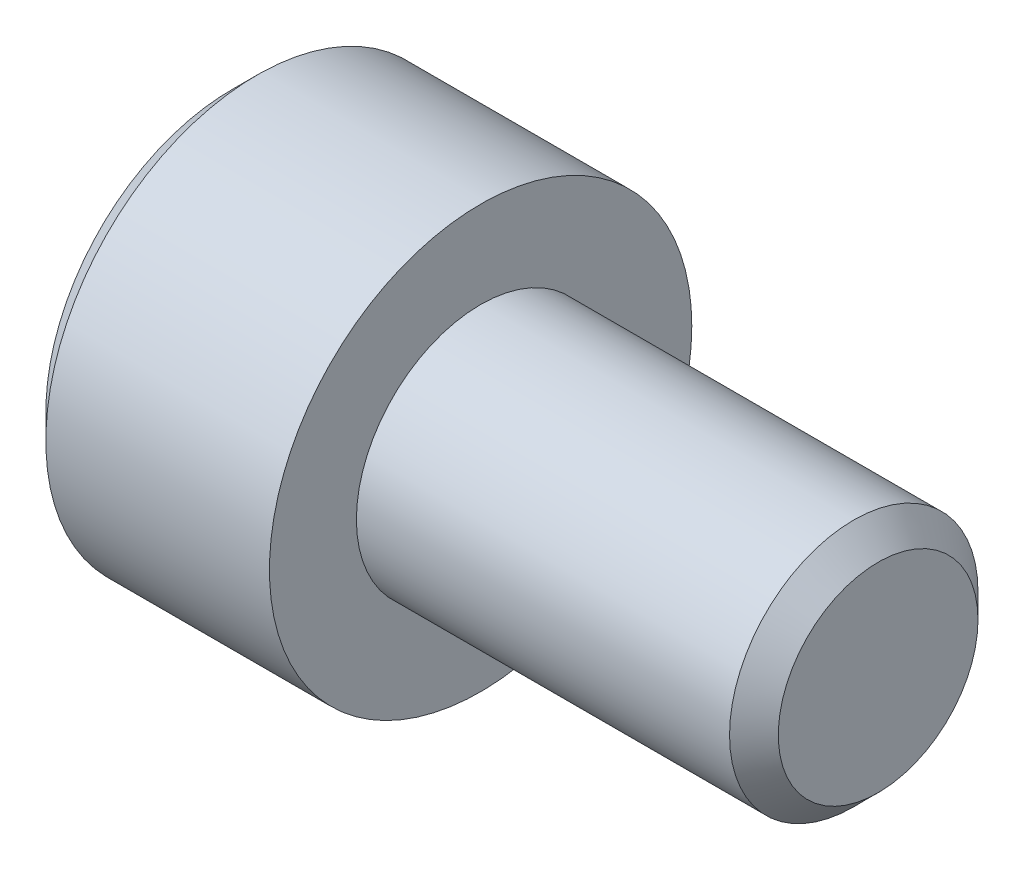
ISO-10303-21;
HEADER;
FILE_DESCRIPTION(('STEP AP214'),'2;1');
FILE_NAME('part.step','',(''),(''),'','','');
FILE_SCHEMA(('AUTOMOTIVE_DESIGN { 1 0 10303 214 1 1 1 1 }'));
ENDSEC;
DATA;
#1=APPLICATION_CONTEXT('core data for automotive mechanical design processes');
#2=APPLICATION_PROTOCOL_DEFINITION('international standard','automotive_design',2000,#1);
#3=PRODUCT_CONTEXT('',#1,'mechanical');
#4=PRODUCT('Part','Part','',(#3));
#5=PRODUCT_RELATED_PRODUCT_CATEGORY('part','',(#4));
#6=PRODUCT_DEFINITION_FORMATION('','',#4);
#7=PRODUCT_DEFINITION_CONTEXT('part definition',#1,'design');
#8=PRODUCT_DEFINITION('design','',#6,#7);
#9=PRODUCT_DEFINITION_SHAPE('','',#8);
#10=(LENGTH_UNIT() NAMED_UNIT(*) SI_UNIT(.MILLI.,.METRE.));
#11=(NAMED_UNIT(*) PLANE_ANGLE_UNIT() SI_UNIT($,.RADIAN.));
#12=(NAMED_UNIT(*) SI_UNIT($,.STERADIAN.) SOLID_ANGLE_UNIT());
#13=UNCERTAINTY_MEASURE_WITH_UNIT(LENGTH_MEASURE(1.E-05),#10,'distance_accuracy_value','');
#14=(GEOMETRIC_REPRESENTATION_CONTEXT(3) GLOBAL_UNCERTAINTY_ASSIGNED_CONTEXT((#13)) GLOBAL_UNIT_ASSIGNED_CONTEXT((#10,
#11,#12)) REPRESENTATION_CONTEXT('',''));
#15=CARTESIAN_POINT('',(0.,0.,0.));
#16=DIRECTION('',(0.,0.,1.));
#17=DIRECTION('',(1.,0.,0.));
#18=AXIS2_PLACEMENT_3D('',#15,#16,#17);
#19=CARTESIAN_POINT('',(-5.,8.88178419700125E-13,-3.05311331771918E-13));
#20=DIRECTION('',(0.999999999999997,0.,0.));
#21=DIRECTION('',(0.,0.,-1.00000000000004));
#22=AXIS2_PLACEMENT_3D('',#19,#20,#21);
#23=PLANE('',#22);
#24=CARTESIAN_POINT('',(-5.,8.88178419700125E-13,-3.05311331771918E-13));
#25=DIRECTION('',(0.999999999999997,0.,0.));
#26=DIRECTION('',(0.,0.,-1.00000000000004));
#27=AXIS2_PLACEMENT_3D('',#24,#25,#26);
#28=CIRCLE('',#27,3.75);
#29=CARTESIAN_POINT('',(-5.,8.95464258299228E-13,-3.75000000000044));
#30=VERTEX_POINT('',#29);
#31=EDGE_CURVE('E11',#30,#30,#28,.T.);
#32=ORIENTED_EDGE('',*,*,#31,.F.);
#33=EDGE_LOOP('',(#32));
#34=FACE_BOUND('',#33,.T.);
#35=DIRECTION('',(0.,0.499999999999994,-0.866025403784471));
#36=VECTOR('',#35,1.);
#37=CARTESIAN_POINT('',(-5.,-2.30940107675748,-2.4980018054066E-13));
#38=LINE('',#37,#36);
#39=CARTESIAN_POINT('',(-5.,-2.30940107675748,-2.4980018054066E-13));
#40=VERTEX_POINT('',#39);
#41=CARTESIAN_POINT('',(-5.,-1.15470053837802,-2.00000000000039));
#42=VERTEX_POINT('',#41);
#43=EDGE_CURVE('E152',#40,#42,#38,.T.);
#44=ORIENTED_EDGE('',*,*,#43,.T.);
#45=DIRECTION('',(0.,0.999999999999987,0.));
#46=VECTOR('',#45,1.);
#47=CARTESIAN_POINT('',(-5.,-1.15470053837802,-2.00000000000039));
#48=LINE('',#47,#46);
#49=CARTESIAN_POINT('',(-5.,1.15470053838018,-2.0000000000002));
#50=VERTEX_POINT('',#49);
#51=EDGE_CURVE('E154',#42,#50,#48,.T.);
#52=ORIENTED_EDGE('',*,*,#51,.T.);
#53=DIRECTION('',(0.,0.499999999999991,0.866025403784469));
#54=VECTOR('',#53,1.);
#55=CARTESIAN_POINT('',(-5.,1.15470053838018,-2.0000000000002));
#56=LINE('',#55,#54);
#57=CARTESIAN_POINT('',(-5.,2.30940107675964,-5.27355936696949E-13));
#58=VERTEX_POINT('',#57);
#59=EDGE_CURVE('E157',#50,#58,#56,.T.);
#60=ORIENTED_EDGE('',*,*,#59,.T.);
#61=DIRECTION('',(0.,-0.499999999999994,0.866025403784471));
#62=VECTOR('',#61,1.);
#63=CARTESIAN_POINT('',(-5.,2.30940107675964,-5.27355936696949E-13));
#64=LINE('',#63,#62);
#65=CARTESIAN_POINT('',(-5.,1.15470053838007,1.99999999999964));
#66=VERTEX_POINT('',#65);
#67=EDGE_CURVE('E99',#58,#66,#64,.T.);
#68=ORIENTED_EDGE('',*,*,#67,.T.);
#69=DIRECTION('',(0.,-0.999999999999987,0.));
#70=VECTOR('',#69,1.);
#71=CARTESIAN_POINT('',(-5.,1.15470053838007,1.99999999999964));
#72=LINE('',#71,#70);
#73=CARTESIAN_POINT('',(-5.,-1.15470053837818,1.99999999999956));
#74=VERTEX_POINT('',#73);
#75=EDGE_CURVE('E159',#66,#74,#72,.T.);
#76=ORIENTED_EDGE('',*,*,#75,.T.);
#77=DIRECTION('',(0.,-0.499999999999991,-0.866025403784469));
#78=VECTOR('',#77,1.);
#79=CARTESIAN_POINT('',(-5.,-1.15470053837818,1.99999999999956));
#80=LINE('',#79,#78);
#81=EDGE_CURVE('E114',#74,#40,#80,.T.);
#82=ORIENTED_EDGE('',*,*,#81,.T.);
#83=EDGE_LOOP('',(#44,#52,#60,#68,#76,#82));
#84=FACE_BOUND('',#83,.T.);
#85=ADVANCED_FACE('F16',(#34,#84),#23,.F.);
#86=CARTESIAN_POINT('',(-5.,8.88178419700125E-13,-3.05311331771918E-13));
#87=DIRECTION('',(0.999999999999997,0.,0.));
#88=DIRECTION('',(0.,0.,-1.00000000000004));
#89=AXIS2_PLACEMENT_3D('',#86,#87,#88);
#90=CONICAL_SURFACE('',#89,3.75,0.785398163397448);
#91=CARTESIAN_POINT('',(-4.49999999999995,1.11022302462516E-12,-6.66133814775094E-13));
#92=DIRECTION('',(0.999999999999997,0.,0.));
#93=DIRECTION('',(0.,0.,-1.00000000000004));
#94=AXIS2_PLACEMENT_3D('',#91,#92,#93);
#95=CIRCLE('',#94,4.25);
#96=CARTESIAN_POINT('',(-4.49999999999995,8.96435705544937E-13,-4.25000000000052));
#97=VERTEX_POINT('',#96);
#98=EDGE_CURVE('E23',#97,#97,#95,.T.);
#99=CARTESIAN_POINT('',(-4.49999999999995,8.96435705544937E-13,-4.25000000000052));
#100=CARTESIAN_POINT('',(-4.50520833333328,8.96425586302794E-13,-4.24479166666718));
#101=CARTESIAN_POINT('',(-4.51041666666662,8.96415467060652E-13,-4.23958333333385));
#102=CARTESIAN_POINT('',(-4.52083333333328,8.96395228576366E-13,-4.22916666666718));
#103=CARTESIAN_POINT('',(-4.52604166666662,8.96385109334223E-13,-4.22395833333385));
#104=CARTESIAN_POINT('',(-4.53645833333329,8.96364870849937E-13,-4.21354166666718));
#105=CARTESIAN_POINT('',(-4.54166666666662,8.96354751607795E-13,-4.20833333333384));
#106=CARTESIAN_POINT('',(-4.55208333333329,8.96334513123509E-13,-4.19791666666718));
#107=CARTESIAN_POINT('',(-4.55729166666662,8.96324393881366E-13,-4.19270833333384));
#108=CARTESIAN_POINT('',(-4.56770833333329,8.96304155397081E-13,-4.18229166666717));
#109=CARTESIAN_POINT('',(-4.57291666666662,8.96294036154938E-13,-4.17708333333384));
#110=CARTESIAN_POINT('',(-4.58333333333329,8.96273797670652E-13,-4.16666666666717));
#111=CARTESIAN_POINT('',(-4.58854166666663,8.9626367842851E-13,-4.16145833333384));
#112=CARTESIAN_POINT('',(-4.59895833333329,8.96243439944224E-13,-4.15104166666717));
#113=CARTESIAN_POINT('',(-4.60416666666663,8.96233320702081E-13,-4.14583333333383));
#114=CARTESIAN_POINT('',(-4.61458333333329,8.96213082217795E-13,-4.13541666666717));
#115=CARTESIAN_POINT('',(-4.61979166666663,8.96202962975652E-13,-4.13020833333383));
#116=CARTESIAN_POINT('',(-4.6302083333333,8.96182724491367E-13,-4.11979166666717));
#117=CARTESIAN_POINT('',(-4.63541666666663,8.96172605249224E-13,-4.11458333333383));
#118=CARTESIAN_POINT('',(-4.6458333333333,8.96152366764939E-13,-4.10416666666716));
#119=CARTESIAN_POINT('',(-4.65104166666663,8.96142247522796E-13,-4.09895833333383));
#120=CARTESIAN_POINT('',(-4.6614583333333,8.9612200903851E-13,-4.08854166666716));
#121=CARTESIAN_POINT('',(-4.66666666666663,8.96111889796367E-13,-4.08333333333383));
#122=CARTESIAN_POINT('',(-4.6770833333333,8.96091651312082E-13,-4.07291666666716));
#123=CARTESIAN_POINT('',(-4.68229166666664,8.96081532069939E-13,-4.06770833333382));
#124=CARTESIAN_POINT('',(-4.6927083333333,8.96061293585653E-13,-4.05729166666715));
#125=CARTESIAN_POINT('',(-4.69791666666664,8.96051174343511E-13,-4.05208333333382));
#126=CARTESIAN_POINT('',(-4.7083333333333,8.96030935859225E-13,-4.04166666666715));
#127=CARTESIAN_POINT('',(-4.71354166666664,8.96020816617082E-13,-4.03645833333382));
#128=CARTESIAN_POINT('',(-4.72395833333331,8.96000578132796E-13,-4.02604166666715));
#129=CARTESIAN_POINT('',(-4.72916666666664,8.95990458890654E-13,-4.02083333333382));
#130=CARTESIAN_POINT('',(-4.73958333333331,8.95970220406368E-13,-4.01041666666715));
#131=CARTESIAN_POINT('',(-4.74479166666664,8.95960101164225E-13,-4.00520833333381));
#132=CARTESIAN_POINT('',(-4.75520833333331,8.95939862679939E-13,-3.99479166666715));
#133=CARTESIAN_POINT('',(-4.76041666666664,8.95929743437797E-13,-3.98958333333381));
#134=CARTESIAN_POINT('',(-4.77083333333331,8.95909504953511E-13,-3.97916666666714));
#135=CARTESIAN_POINT('',(-4.77604166666665,8.95899385711368E-13,-3.97395833333381));
#136=CARTESIAN_POINT('',(-4.78645833333331,8.95879147227083E-13,-3.96354166666714));
#137=CARTESIAN_POINT('',(-4.79166666666665,8.9586902798494E-13,-3.95833333333381));
#138=CARTESIAN_POINT('',(-4.80208333333332,8.95848789500654E-13,-3.94791666666714));
#139=CARTESIAN_POINT('',(-4.80729166666665,8.95838670258512E-13,-3.9427083333338));
#140=CARTESIAN_POINT('',(-4.81770833333332,8.95818431774226E-13,-3.93229166666714));
#141=CARTESIAN_POINT('',(-4.82291666666665,8.95808312532083E-13,-3.9270833333338));
#142=CARTESIAN_POINT('',(-4.83333333333332,8.95788074047798E-13,-3.91666666666713));
#143=CARTESIAN_POINT('',(-4.83854166666665,8.95777954805655E-13,-3.9114583333338));
#144=CARTESIAN_POINT('',(-4.84895833333332,8.95757716321369E-13,-3.90104166666713));
#145=CARTESIAN_POINT('',(-4.85416666666665,8.95747597079227E-13,-3.8958333333338));
#146=CARTESIAN_POINT('',(-4.86458333333332,8.95727358594941E-13,-3.88541666666713));
#147=CARTESIAN_POINT('',(-4.86979166666666,8.95717239352798E-13,-3.88020833333379));
#148=CARTESIAN_POINT('',(-4.88020833333332,8.95697000868512E-13,-3.86979166666713));
#149=CARTESIAN_POINT('',(-4.88541666666666,8.9568688162637E-13,-3.86458333333379));
#150=CARTESIAN_POINT('',(-4.89583333333333,8.95666643142084E-13,-3.85416666666712));
#151=CARTESIAN_POINT('',(-4.90104166666666,8.95656523899941E-13,-3.84895833333379));
#152=CARTESIAN_POINT('',(-4.91145833333333,8.95636285415655E-13,-3.83854166666712));
#153=CARTESIAN_POINT('',(-4.91666666666666,8.95626166173513E-13,-3.83333333333379));
#154=CARTESIAN_POINT('',(-4.92708333333333,8.95605927689227E-13,-3.82291666666712));
#155=CARTESIAN_POINT('',(-4.93229166666666,8.95595808447084E-13,-3.81770833333379));
#156=CARTESIAN_POINT('',(-4.94270833333333,8.95575569962799E-13,-3.80729166666712));
#157=CARTESIAN_POINT('',(-4.94791666666667,8.95565450720656E-13,-3.80208333333378));
#158=CARTESIAN_POINT('',(-4.95833333333333,8.9554521223637E-13,-3.79166666666712));
#159=CARTESIAN_POINT('',(-4.96354166666667,8.95535092994228E-13,-3.78645833333378));
#160=CARTESIAN_POINT('',(-4.97395833333333,8.95514854509942E-13,-3.77604166666711));
#161=CARTESIAN_POINT('',(-4.97916666666667,8.95504735267799E-13,-3.77083333333378));
#162=CARTESIAN_POINT('',(-4.98958333333334,8.95484496783513E-13,-3.76041666666711));
#163=CARTESIAN_POINT('',(-4.99479166666667,8.95474377541371E-13,-3.75520833333378));
#164=CARTESIAN_POINT('',(-5.,8.95464258299228E-13,-3.75000000000044));
#165=B_SPLINE_CURVE_WITH_KNOTS('',3,(#99,#100,#101,#102,#103,#104,#105,#106,#107,#108,#109,#110,
#111,#112,#113,#114,#115,#116,#117,#118,#119,#120,#121,#122,#123,#124,#125,#126,#127,#128,#129,
#130,#131,#132,#133,#134,#135,#136,#137,#138,#139,#140,#141,#142,#143,#144,#145,#146,#147,#148,
#149,#150,#151,#152,#153,#154,#155,#156,#157,#158,#159,#160,#161,#162,#163,#164),.UNSPECIFIED.,
.F.,.F.,(4,2,2,2,2,2,2,2,2,2,2,2,2,2,2,2,2,2,2,2,2,2,2,2,2,2,2,2,2,2,2,2,4),(0.,
0.0220970869120821,0.0441941738241648,0.0662912607362475,0.0883883476483296,0.110485434560412,
0.132582521472495,0.154679608384577,0.17677669529666,0.198873782208742,0.220970869120825,
0.243067956032907,0.26516504294499,0.287262129857073,0.309359216769155,0.331456303681237,
0.35355339059332,0.375650477505403,0.397747564417485,0.419844651329567,0.44194173824165,
0.464038825153732,0.486135912065814,0.508232998977897,0.53033008588998,0.552427172802062,
0.574524259714145,0.596621346626227,0.61871843353831,0.640815520450392,0.662912607362474,
0.685009694274557,0.70710678118664),.UNSPECIFIED.);
#166=EDGE_CURVE('BSEAM143',#97,#30,#165,.T.);
#167=ORIENTED_EDGE('',*,*,#98,.F.);
#168=ORIENTED_EDGE('',*,*,#31,.T.);
#169=ORIENTED_EDGE('',*,*,#166,.T.);
#170=ORIENTED_EDGE('',*,*,#166,.F.);
#171=EDGE_LOOP('',(#167,#169,#168,#170));
#172=FACE_BOUND('',#171,.T.);
#173=ADVANCED_FACE('F143',(#172),#90,.T.);
#174=CARTESIAN_POINT('',(8.00000000000001,1.33226762955019E-12,-3.33066907387547E-13));
#175=DIRECTION('',(0.999999999999997,0.,0.));
#176=DIRECTION('',(0.,0.,-1.00000000000004));
#177=AXIS2_PLACEMENT_3D('',#174,#175,#176);
#178=CYLINDRICAL_SURFACE('',#177,4.25);
#179=CARTESIAN_POINT('',(0.,0.,0.));
#180=DIRECTION('',(0.999999999999997,0.,0.));
#181=DIRECTION('',(0.,0.,-1.00000000000004));
#182=AXIS2_PLACEMENT_3D('',#179,#180,#181);
#183=CIRCLE('',#182,4.25);
#184=CARTESIAN_POINT('',(0.,1.34052487970924E-12,-4.25000000000049));
#185=VERTEX_POINT('',#184);
#186=EDGE_CURVE('E136',#185,#185,#183,.T.);
#187=CARTESIAN_POINT('',(0.,1.34052487970924E-12,-4.25000000000049));
#188=CARTESIAN_POINT('',(-0.0468749999999989,1.34052487951245E-12,-4.25000000000049));
#189=CARTESIAN_POINT('',(-0.0937499999999978,1.34052487931565E-12,-4.25000000000049));
#190=CARTESIAN_POINT('',(-0.187499999999996,1.34052487892206E-12,-4.25000000000049));
#191=CARTESIAN_POINT('',(-0.234374999999996,1.34052487872526E-12,-4.25000000000049));
#192=CARTESIAN_POINT('',(-0.328124999999995,1.34052487833167E-12,-4.25000000000049));
#193=CARTESIAN_POINT('',(-0.374999999999995,1.34052487813487E-12,-4.25000000000049));
#194=CARTESIAN_POINT('',(-0.468749999999995,1.34052487774128E-12,-4.25000000000049));
#195=CARTESIAN_POINT('',(-0.515624999999994,1.34052487754448E-12,-4.25000000000049));
#196=CARTESIAN_POINT('',(-0.609374999999993,1.34052487715089E-12,-4.25000000000049));
#197=CARTESIAN_POINT('',(-0.656249999999992,1.34052487695409E-12,-4.25000000000049));
#198=CARTESIAN_POINT('',(-0.749999999999991,1.3405248765605E-12,-4.25000000000049));
#199=CARTESIAN_POINT('',(-0.79687499999999,1.3405248763637E-12,-4.25000000000049));
#200=CARTESIAN_POINT('',(-0.890624999999988,1.34052487597011E-12,-4.25000000000049));
#201=CARTESIAN_POINT('',(-0.937499999999987,1.34052487577331E-12,-4.25000000000049));
#202=CARTESIAN_POINT('',(-1.03124999999999,1.34052487537972E-12,-4.25000000000049));
#203=CARTESIAN_POINT('',(-1.07812499999999,1.34052487518292E-12,-4.25000000000049));
#204=CARTESIAN_POINT('',(-1.17187499999999,1.34052487478933E-12,-4.25000000000049));
#205=CARTESIAN_POINT('',(-1.21874999999999,1.34052487459254E-12,-4.25000000000049));
#206=CARTESIAN_POINT('',(-1.31249999999998,1.34052487419894E-12,-4.25000000000049));
#207=CARTESIAN_POINT('',(-1.35937499999998,1.34052487400215E-12,-4.25000000000049));
#208=CARTESIAN_POINT('',(-1.45312499999998,1.34052487360855E-12,-4.25000000000049));
#209=CARTESIAN_POINT('',(-1.49999999999998,1.34052487341176E-12,-4.25000000000049));
#210=CARTESIAN_POINT('',(-1.59374999999998,1.34052487301816E-12,-4.25000000000049));
#211=CARTESIAN_POINT('',(-1.64062499999998,1.34052487282137E-12,-4.25000000000049));
#212=CARTESIAN_POINT('',(-1.73437499999998,1.34052487242777E-12,-4.25000000000049));
#213=CARTESIAN_POINT('',(-1.78124999999998,1.34052487223098E-12,-4.25000000000049));
#214=CARTESIAN_POINT('',(-1.87499999999998,1.34052487183739E-12,-4.25000000000049));
#215=CARTESIAN_POINT('',(-1.92187499999998,1.34052487164059E-12,-4.25000000000049));
#216=CARTESIAN_POINT('',(-2.01562499999998,1.340524871247E-12,-4.25000000000049));
#217=CARTESIAN_POINT('',(-2.06249999999997,1.3405248710502E-12,-4.25000000000049));
#218=CARTESIAN_POINT('',(-2.15624999999997,1.34052487065661E-12,-4.25000000000049));
#219=CARTESIAN_POINT('',(-2.20312499999997,1.34052487045981E-12,-4.25000000000049));
#220=CARTESIAN_POINT('',(-2.29687499999997,1.34052487006622E-12,-4.25000000000049));
#221=CARTESIAN_POINT('',(-2.34374999999997,1.34052486986942E-12,-4.25000000000049));
#222=CARTESIAN_POINT('',(-2.43749999999997,1.34052486947583E-12,-4.25000000000049));
#223=CARTESIAN_POINT('',(-2.48437499999997,1.34052486927903E-12,-4.25000000000049));
#224=CARTESIAN_POINT('',(-2.57812499999997,1.34052486888544E-12,-4.25000000000049));
#225=CARTESIAN_POINT('',(-2.62499999999997,1.34052486868864E-12,-4.25000000000049));
#226=CARTESIAN_POINT('',(-2.71874999999997,1.34052486829505E-12,-4.25000000000049));
#227=CARTESIAN_POINT('',(-2.76562499999997,1.34052486809825E-12,-4.25000000000049));
#228=CARTESIAN_POINT('',(-2.85937499999997,1.34052486770466E-12,-4.25000000000049));
#229=CARTESIAN_POINT('',(-2.90624999999996,1.34052486750786E-12,-4.25000000000049));
#230=CARTESIAN_POINT('',(-2.99999999999996,1.34052486711427E-12,-4.25000000000049));
#231=CARTESIAN_POINT('',(-3.04687499999996,1.34052486691747E-12,-4.25000000000049));
#232=CARTESIAN_POINT('',(-3.14062499999996,1.34052486652388E-12,-4.25000000000049));
#233=CARTESIAN_POINT('',(-3.18749999999996,1.34052486632708E-12,-4.25000000000049));
#234=CARTESIAN_POINT('',(-3.28124999999996,1.34052486593349E-12,-4.25000000000049));
#235=CARTESIAN_POINT('',(-3.32812499999996,1.34052486573669E-12,-4.25000000000049));
#236=CARTESIAN_POINT('',(-3.42187499999996,1.3405248653431E-12,-4.25000000000049));
#237=CARTESIAN_POINT('',(-3.46874999999996,1.34052486514631E-12,-4.25000000000049));
#238=CARTESIAN_POINT('',(-3.56249999999996,1.34052486475271E-12,-4.25000000000049));
#239=CARTESIAN_POINT('',(-3.60937499999996,1.34052486455592E-12,-4.25000000000049));
#240=CARTESIAN_POINT('',(-3.70312499999996,1.34052486416232E-12,-4.25000000000049));
#241=CARTESIAN_POINT('',(-3.74999999999996,1.34052486396553E-12,-4.25000000000049));
#242=CARTESIAN_POINT('',(-3.84374999999995,1.34052486357193E-12,-4.25000000000049));
#243=CARTESIAN_POINT('',(-3.89062499999995,1.34052486337514E-12,-4.25000000000049));
#244=CARTESIAN_POINT('',(-3.98437499999995,1.34052486298154E-12,-4.25000000000049));
#245=CARTESIAN_POINT('',(-4.03124999999995,1.34052486278475E-12,-4.25000000000049));
#246=CARTESIAN_POINT('',(-4.12499999999995,1.34052486239116E-12,-4.25000000000049));
#247=CARTESIAN_POINT('',(-4.17187499999995,1.34052486219436E-12,-4.25000000000049));
#248=CARTESIAN_POINT('',(-4.26562499999995,1.34052486180077E-12,-4.25000000000049));
#249=CARTESIAN_POINT('',(-4.31249999999995,1.34052486160397E-12,-4.25000000000049));
#250=CARTESIAN_POINT('',(-4.40624999999995,1.34052486121038E-12,-4.25000000000049));
#251=CARTESIAN_POINT('',(-4.45312499999995,1.34052486101358E-12,-4.25000000000049));
#252=CARTESIAN_POINT('',(-4.49999999999995,1.34052486081678E-12,-4.25000000000049));
#253=B_SPLINE_CURVE_WITH_KNOTS('',3,(#187,#188,#189,#190,#191,#192,#193,#194,#195,#196,#197,
#198,#199,#200,#201,#202,#203,#204,#205,#206,#207,#208,#209,#210,#211,#212,#213,#214,#215,#216,
#217,#218,#219,#220,#221,#222,#223,#224,#225,#226,#227,#228,#229,#230,#231,#232,#233,#234,#235,
#236,#237,#238,#239,#240,#241,#242,#243,#244,#245,#246,#247,#248,#249,#250,#251,#252),
.UNSPECIFIED.,.F.,.F.,(4,2,2,2,2,2,2,2,2,2,2,2,2,2,2,2,2,2,2,2,2,2,2,2,2,2,2,2,2,2,2,2,4),(0.,
0.140624999999997,0.281249999999995,0.421874999999995,0.562499999999994,0.703124999999992,
0.843749999999989,0.984374999999987,1.12499999999999,1.26562499999999,1.40624999999998,
1.54687499999998,1.68749999999998,1.82812499999998,1.96874999999998,2.10937499999997,
2.24999999999997,2.39062499999997,2.53124999999997,2.67187499999997,2.81249999999997,
2.95312499999996,3.09374999999996,3.23437499999996,3.37499999999996,3.51562499999996,
3.65624999999996,3.79687499999995,3.93749999999995,4.07812499999995,4.21874999999995,
4.35937499999995,4.49999999999995),.UNSPECIFIED.);
#254=EDGE_CURVE('BSEAM141',#185,#97,#253,.T.);
#255=ORIENTED_EDGE('',*,*,#186,.F.);
#256=ORIENTED_EDGE('',*,*,#98,.T.);
#257=ORIENTED_EDGE('',*,*,#254,.T.);
#258=ORIENTED_EDGE('',*,*,#254,.F.);
#259=EDGE_LOOP('',(#255,#257,#256,#258));
#260=FACE_BOUND('',#259,.T.);
#261=ADVANCED_FACE('F141',(#260),#178,.T.);
#262=CARTESIAN_POINT('',(-4.44089209850063E-13,4.25000000000053,-3.88578058618805E-13));
#263=DIRECTION('',(-0.999999999999997,0.,0.));
#264=DIRECTION('',(0.,0.,1.00000000000004));
#265=AXIS2_PLACEMENT_3D('',#262,#263,#264);
#266=PLANE('',#265);
#267=CARTESIAN_POINT('',(0.,0.,0.));
#268=DIRECTION('',(0.999999999999997,0.,0.));
#269=DIRECTION('',(0.,0.,-1.00000000000004));
#270=AXIS2_PLACEMENT_3D('',#267,#268,#269);
#271=CIRCLE('',#270,2.5);
#272=CARTESIAN_POINT('',(0.,1.33712482169633E-12,-2.50000000000042));
#273=VERTEX_POINT('',#272);
#274=EDGE_CURVE('E133',#273,#273,#271,.T.);
#275=ORIENTED_EDGE('',*,*,#274,.F.);
#276=EDGE_LOOP('',(#275));
#277=FACE_BOUND('',#276,.T.);
#278=ORIENTED_EDGE('',*,*,#186,.T.);
#279=EDGE_LOOP('',(#278));
#280=FACE_BOUND('',#279,.T.);
#281=ADVANCED_FACE('F250',(#277,#280),#266,.F.);
#282=CARTESIAN_POINT('',(8.00000000000001,1.33226762955019E-12,-3.33066907387547E-13));
#283=DIRECTION('',(0.999999999999997,0.,0.));
#284=DIRECTION('',(0.,0.,-1.00000000000004));
#285=AXIS2_PLACEMENT_3D('',#282,#283,#284);
#286=CYLINDRICAL_SURFACE('',#285,2.5);
#287=CARTESIAN_POINT('',(7.50949999999995,1.33226762955019E-12,-3.33066907387547E-13));
#288=DIRECTION('',(0.999999999999997,0.,0.));
#289=DIRECTION('',(0.,0.,-1.00000000000004));
#290=AXIS2_PLACEMENT_3D('',#287,#288,#289);
#291=CIRCLE('',#290,2.5);
#292=CARTESIAN_POINT('',(7.50949999999995,1.33712485322364E-12,-2.50000000000042));
#293=VERTEX_POINT('',#292);
#294=EDGE_CURVE('E130',#293,#293,#291,.T.);
#295=CARTESIAN_POINT('',(7.50949999999995,1.33712485322364E-12,-2.50000000000042));
#296=CARTESIAN_POINT('',(7.43127604166661,1.33712485289524E-12,-2.50000000000042));
#297=CARTESIAN_POINT('',(7.35305208333328,1.33712485256683E-12,-2.50000000000042));
#298=CARTESIAN_POINT('',(7.19660416666662,1.33712485191001E-12,-2.50000000000042));
#299=CARTESIAN_POINT('',(7.11838020833328,1.3371248515816E-12,-2.50000000000042));
#300=CARTESIAN_POINT('',(6.96193229166662,1.33712485092478E-12,-2.50000000000042));
#301=CARTESIAN_POINT('',(6.88370833333328,1.33712485059637E-12,-2.50000000000042));
#302=CARTESIAN_POINT('',(6.72726041666662,1.33712484993955E-12,-2.50000000000042));
#303=CARTESIAN_POINT('',(6.64903645833329,1.33712484961114E-12,-2.50000000000042));
#304=CARTESIAN_POINT('',(6.49258854166662,1.33712484895432E-12,-2.50000000000042));
#305=CARTESIAN_POINT('',(6.41436458333329,1.33712484862591E-12,-2.50000000000042));
#306=CARTESIAN_POINT('',(6.25791666666662,1.33712484796909E-12,-2.50000000000042));
#307=CARTESIAN_POINT('',(6.17969270833329,1.33712484764068E-12,-2.50000000000042));
#308=CARTESIAN_POINT('',(6.02324479166662,1.33712484698386E-12,-2.50000000000042));
#309=CARTESIAN_POINT('',(5.94502083333329,1.33712484665545E-12,-2.50000000000042));
#310=CARTESIAN_POINT('',(5.78857291666663,1.33712484599863E-12,-2.50000000000042));
#311=CARTESIAN_POINT('',(5.71034895833329,1.33712484567023E-12,-2.50000000000042));
#312=CARTESIAN_POINT('',(5.55390104166663,1.33712484501341E-12,-2.50000000000042));
#313=CARTESIAN_POINT('',(5.47567708333329,1.337124844685E-12,-2.50000000000042));
#314=CARTESIAN_POINT('',(5.31922916666663,1.33712484402818E-12,-2.50000000000042));
#315=CARTESIAN_POINT('',(5.2410052083333,1.33712484369977E-12,-2.50000000000042));
#316=CARTESIAN_POINT('',(5.08455729166663,1.33712484304295E-12,-2.50000000000042));
#317=CARTESIAN_POINT('',(5.0063333333333,1.33712484271454E-12,-2.50000000000042));
#318=CARTESIAN_POINT('',(4.84988541666663,1.33712484205772E-12,-2.50000000000042));
#319=CARTESIAN_POINT('',(4.7716614583333,1.33712484172931E-12,-2.50000000000042));
#320=CARTESIAN_POINT('',(4.61521354166663,1.33712484107249E-12,-2.50000000000042));
#321=CARTESIAN_POINT('',(4.5369895833333,1.33712484074408E-12,-2.50000000000042));
#322=CARTESIAN_POINT('',(4.38054166666664,1.33712484008726E-12,-2.50000000000042));
#323=CARTESIAN_POINT('',(4.3023177083333,1.33712483975885E-12,-2.50000000000042));
#324=CARTESIAN_POINT('',(4.14586979166664,1.33712483910203E-12,-2.50000000000042));
#325=CARTESIAN_POINT('',(4.0676458333333,1.33712483877362E-12,-2.50000000000042));
#326=CARTESIAN_POINT('',(3.91119791666664,1.33712483811681E-12,-2.50000000000042));
#327=CARTESIAN_POINT('',(3.83297395833331,1.3371248377884E-12,-2.50000000000042));
#328=CARTESIAN_POINT('',(3.67652604166664,1.33712483713158E-12,-2.50000000000042));
#329=CARTESIAN_POINT('',(3.59830208333331,1.33712483680317E-12,-2.50000000000042));
#330=CARTESIAN_POINT('',(3.44185416666664,1.33712483614635E-12,-2.50000000000042));
#331=CARTESIAN_POINT('',(3.36363020833331,1.33712483581794E-12,-2.50000000000042));
#332=CARTESIAN_POINT('',(3.20718229166664,1.33712483516112E-12,-2.50000000000042));
#333=CARTESIAN_POINT('',(3.12895833333331,1.33712483483271E-12,-2.50000000000042));
#334=CARTESIAN_POINT('',(2.97251041666665,1.33712483417589E-12,-2.50000000000042));
#335=CARTESIAN_POINT('',(2.89428645833331,1.33712483384748E-12,-2.50000000000042));
#336=CARTESIAN_POINT('',(2.73783854166665,1.33712483319066E-12,-2.50000000000042));
#337=CARTESIAN_POINT('',(2.65961458333332,1.33712483286225E-12,-2.50000000000042));
#338=CARTESIAN_POINT('',(2.50316666666665,1.33712483220543E-12,-2.50000000000042));
#339=CARTESIAN_POINT('',(2.42494270833332,1.33712483187702E-12,-2.50000000000042));
#340=CARTESIAN_POINT('',(2.26849479166665,1.33712483122021E-12,-2.50000000000042));
#341=CARTESIAN_POINT('',(2.19027083333332,1.3371248308918E-12,-2.50000000000042));
#342=CARTESIAN_POINT('',(2.03382291666665,1.33712483023498E-12,-2.50000000000042));
#343=CARTESIAN_POINT('',(1.95559895833332,1.33712482990657E-12,-2.50000000000042));
#344=CARTESIAN_POINT('',(1.79915104166665,1.33712482924975E-12,-2.50000000000042));
#345=CARTESIAN_POINT('',(1.72092708333332,1.33712482892134E-12,-2.50000000000042));
#346=CARTESIAN_POINT('',(1.56447916666666,1.33712482826452E-12,-2.50000000000042));
#347=CARTESIAN_POINT('',(1.48625520833332,1.33712482793611E-12,-2.50000000000042));
#348=CARTESIAN_POINT('',(1.32980729166666,1.33712482727929E-12,-2.50000000000042));
#349=CARTESIAN_POINT('',(1.25158333333333,1.33712482695088E-12,-2.50000000000042));
#350=CARTESIAN_POINT('',(1.09513541666666,1.33712482629406E-12,-2.50000000000042));
#351=CARTESIAN_POINT('',(1.01691145833333,1.33712482596565E-12,-2.50000000000042));
#352=CARTESIAN_POINT('',(0.860463541666661,1.33712482530883E-12,-2.50000000000042));
#353=CARTESIAN_POINT('',(0.782239583333328,1.33712482498042E-12,-2.50000000000042));
#354=CARTESIAN_POINT('',(0.625791666666662,1.3371248243236E-12,-2.50000000000042));
#355=CARTESIAN_POINT('',(0.547567708333329,1.3371248239952E-12,-2.50000000000042));
#356=CARTESIAN_POINT('',(0.391119791666664,1.33712482333838E-12,-2.50000000000042));
#357=CARTESIAN_POINT('',(0.312895833333332,1.33712482300997E-12,-2.50000000000042));
#358=CARTESIAN_POINT('',(0.156447916666666,1.33712482235315E-12,-2.50000000000042));
#359=CARTESIAN_POINT('',(0.0782239583333331,1.33712482202474E-12,-2.50000000000042));
#360=CARTESIAN_POINT('',(0.,1.33712482169633E-12,-2.50000000000042));
#361=B_SPLINE_CURVE_WITH_KNOTS('',3,(#295,#296,#297,#298,#299,#300,#301,#302,#303,#304,#305,
#306,#307,#308,#309,#310,#311,#312,#313,#314,#315,#316,#317,#318,#319,#320,#321,#322,#323,#324,
#325,#326,#327,#328,#329,#330,#331,#332,#333,#334,#335,#336,#337,#338,#339,#340,#341,#342,#343,
#344,#345,#346,#347,#348,#349,#350,#351,#352,#353,#354,#355,#356,#357,#358,#359,#360),
.UNSPECIFIED.,.F.,.F.,(4,2,2,2,2,2,2,2,2,2,2,2,2,2,2,2,2,2,2,2,2,2,2,2,2,2,2,2,2,2,2,2,4),(0.,
0.234671874999998,0.469343749999997,0.704015624999994,0.938687499999993,1.17335937499999,
1.40803124999999,1.64270312499999,1.87737499999999,2.11204687499999,2.34671874999998,
2.58139062499998,2.81606249999998,3.05073437499998,3.28540624999998,3.52007812499998,
3.75474999999997,3.98942187499997,4.22409374999997,4.45876562499997,4.69343749999997,
4.92810937499996,5.16278124999996,5.39745312499996,5.63212499999996,5.86679687499996,
6.10146874999996,6.33614062499995,6.57081249999995,6.80548437499995,7.04015624999995,
7.27482812499995,7.50949999999995),.UNSPECIFIED.);
#362=EDGE_CURVE('BSEAM246',#293,#273,#361,.T.);
#363=ORIENTED_EDGE('',*,*,#294,.F.);
#364=ORIENTED_EDGE('',*,*,#274,.T.);
#365=ORIENTED_EDGE('',*,*,#362,.T.);
#366=ORIENTED_EDGE('',*,*,#362,.F.);
#367=EDGE_LOOP('',(#363,#365,#364,#366));
#368=FACE_BOUND('',#367,.T.);
#369=ADVANCED_FACE('F246',(#368),#286,.T.);
#370=CARTESIAN_POINT('',(7.50949999999995,1.33226762955019E-12,-3.33066907387547E-13));
#371=DIRECTION('',(-0.999999999999997,0.,0.));
#372=DIRECTION('',(0.,0.,1.00000000000004));
#373=AXIS2_PLACEMENT_3D('',#370,#371,#372);
#374=CONICAL_SURFACE('',#373,2.5,0.785398163397448);
#375=CARTESIAN_POINT('',(8.00000000000001,1.33226762955019E-12,-3.33066907387547E-13));
#376=DIRECTION('',(0.999999999999997,0.,0.));
#377=DIRECTION('',(0.,0.,-1.00000000000004));
#378=AXIS2_PLACEMENT_3D('',#375,#376,#377);
#379=CIRCLE('',#378,2.0095);
#380=CARTESIAN_POINT('',(8.00000000000001,1.33617186759416E-12,-2.00950000000041));
#381=VERTEX_POINT('',#380);
#382=EDGE_CURVE('E126',#381,#381,#379,.T.);
#383=ORIENTED_EDGE('',*,*,#382,.F.);
#384=EDGE_LOOP('',(#383));
#385=FACE_BOUND('',#384,.T.);
#386=ORIENTED_EDGE('',*,*,#294,.T.);
#387=EDGE_LOOP('',(#386));
#388=FACE_BOUND('',#387,.T.);
#389=ADVANCED_FACE('F242',(#385,#388),#374,.T.);
#390=CARTESIAN_POINT('',(8.00000000000001,2.00950000000022,0.));
#391=DIRECTION('',(-0.999999999999997,0.,0.));
#392=DIRECTION('',(0.,0.,1.00000000000004));
#393=AXIS2_PLACEMENT_3D('',#390,#391,#392);
#394=PLANE('',#393);
#395=ORIENTED_EDGE('',*,*,#382,.T.);
#396=EDGE_LOOP('',(#395));
#397=FACE_BOUND('',#396,.T.);
#398=ADVANCED_FACE('F237',(#397),#394,.F.);
#399=CARTESIAN_POINT('',(-2.50000000000006,1.15470053837963,2.00000000000009));
#400=DIRECTION('',(0.,0.,-1.00000000000004));
#401=DIRECTION('',(-0.999999999999997,0.,0.));
#402=AXIS2_PLACEMENT_3D('',#399,#400,#401);
#403=PLANE('',#402);
#404=ORIENTED_EDGE('',*,*,#75,.F.);
#405=DIRECTION('',(-0.999999999999997,0.,0.));
#406=VECTOR('',#405,1.);
#407=CARTESIAN_POINT('',(-2.50000000000006,1.15470053837963,2.00000000000009));
#408=LINE('',#407,#406);
#409=CARTESIAN_POINT('',(-2.50000000000006,1.15470053837963,2.00000000000009));
#410=VERTEX_POINT('',#409);
#411=EDGE_CURVE('E166',#410,#66,#408,.T.);
#412=ORIENTED_EDGE('',*,*,#411,.F.);
#413=DIRECTION('',(0.,-0.999999999999987,0.));
#414=VECTOR('',#413,1.);
#415=CARTESIAN_POINT('',(-2.50000000000006,1.15470053837963,2.00000000000009));
#416=LINE('',#415,#414);
#417=CARTESIAN_POINT('',(-2.49999999999995,5.55111512312578E-13,1.99999999999967));
#418=VERTEX_POINT('',#417);
#419=EDGE_CURVE('E96',#410,#418,#416,.T.);
#420=ORIENTED_EDGE('',*,*,#419,.T.);
#421=CARTESIAN_POINT('',(-2.49999999999995,-1.15470053837885,1.99999999999992));
#422=VERTEX_POINT('',#421);
#423=EDGE_CURVE('E88',#418,#422,#416,.T.);
#424=ORIENTED_EDGE('',*,*,#423,.T.);
#425=DIRECTION('',(-0.999999999999997,0.,0.));
#426=VECTOR('',#425,1.);
#427=CARTESIAN_POINT('',(-2.49999999999995,-1.15470053837885,1.99999999999992));
#428=LINE('',#427,#426);
#429=EDGE_CURVE('E92',#422,#74,#428,.T.);
#430=ORIENTED_EDGE('',*,*,#429,.T.);
#431=EDGE_LOOP('',(#404,#412,#420,#424,#430));
#432=FACE_BOUND('',#431,.T.);
#433=ADVANCED_FACE('F90',(#432),#403,.T.);
#434=CARTESIAN_POINT('',(-2.49999999999995,-1.15470053837885,1.99999999999992));
#435=DIRECTION('',(0.,0.866025403784427,-0.500000000000019));
#436=DIRECTION('',(0.,0.499999999999992,0.86602540378447));
#437=AXIS2_PLACEMENT_3D('',#434,#435,#436);
#438=PLANE('',#437);
#439=ORIENTED_EDGE('',*,*,#81,.F.);
#440=ORIENTED_EDGE('',*,*,#429,.F.);
#441=DIRECTION('',(0.,-0.499999999999991,-0.866025403784469));
#442=VECTOR('',#441,1.);
#443=CARTESIAN_POINT('',(-2.49999999999995,-1.15470053837885,1.99999999999992));
#444=LINE('',#443,#442);
#445=CARTESIAN_POINT('',(-2.49999999999995,-1.73205080756811,0.999999999999779));
#446=VERTEX_POINT('',#445);
#447=EDGE_CURVE('E102',#422,#446,#444,.T.);
#448=ORIENTED_EDGE('',*,*,#447,.T.);
#449=CARTESIAN_POINT('',(-2.49999999999995,-2.3094010767582,0.));
#450=VERTEX_POINT('',#449);
#451=EDGE_CURVE('E109',#446,#450,#444,.T.);
#452=ORIENTED_EDGE('',*,*,#451,.T.);
#453=DIRECTION('',(-0.999999999999997,0.,0.));
#454=VECTOR('',#453,1.);
#455=CARTESIAN_POINT('',(-2.49999999999995,-2.3094010767582,0.));
#456=LINE('',#455,#454);
#457=EDGE_CURVE('E116',#450,#40,#456,.T.);
#458=ORIENTED_EDGE('',*,*,#457,.T.);
#459=EDGE_LOOP('',(#439,#440,#448,#452,#458));
#460=FACE_BOUND('',#459,.T.);
#461=ADVANCED_FACE('F111',(#460),#438,.T.);
#462=CARTESIAN_POINT('',(-2.49999999999995,-2.3094010767582,0.));
#463=DIRECTION('',(0.,0.866025403784427,0.500000000000017));
#464=DIRECTION('',(0.,-0.499999999999996,0.866025403784472));
#465=AXIS2_PLACEMENT_3D('',#462,#463,#464);
#466=PLANE('',#465);
#467=ORIENTED_EDGE('',*,*,#43,.F.);
#468=ORIENTED_EDGE('',*,*,#457,.F.);
#469=DIRECTION('',(0.,0.499999999999994,-0.866025403784471));
#470=VECTOR('',#469,1.);
#471=CARTESIAN_POINT('',(-2.49999999999995,-2.3094010767582,0.));
#472=LINE('',#471,#470);
#473=CARTESIAN_POINT('',(-2.50000000000006,-1.73205080756855,-1.00000000000011));
#474=VERTEX_POINT('',#473);
#475=EDGE_CURVE('E30',#450,#474,#472,.T.);
#476=ORIENTED_EDGE('',*,*,#475,.T.);
#477=CARTESIAN_POINT('',(-2.49999999999995,-1.15470053837852,-2.00000000000047));
#478=VERTEX_POINT('',#477);
#479=EDGE_CURVE('E108',#474,#478,#472,.T.);
#480=ORIENTED_EDGE('',*,*,#479,.T.);
#481=DIRECTION('',(-0.999999999999997,0.,0.));
#482=VECTOR('',#481,1.);
#483=CARTESIAN_POINT('',(-2.49999999999995,-1.15470053837852,-2.00000000000047));
#484=LINE('',#483,#482);
#485=EDGE_CURVE('E122',#478,#42,#484,.T.);
#486=ORIENTED_EDGE('',*,*,#485,.T.);
#487=EDGE_LOOP('',(#467,#468,#476,#480,#486));
#488=FACE_BOUND('',#487,.T.);
#489=ADVANCED_FACE('F176',(#488),#466,.T.);
#490=CARTESIAN_POINT('',(-2.49999999999995,-1.15470053837852,-2.00000000000047));
#491=DIRECTION('',(0.,0.,1.00000000000004));
#492=DIRECTION('',(0.999999999999997,0.,0.));
#493=AXIS2_PLACEMENT_3D('',#490,#491,#492);
#494=PLANE('',#493);
#495=ORIENTED_EDGE('',*,*,#51,.F.);
#496=ORIENTED_EDGE('',*,*,#485,.F.);
#497=DIRECTION('',(0.,0.999999999999987,0.));
#498=VECTOR('',#497,1.);
#499=CARTESIAN_POINT('',(-2.49999999999995,-1.15470053837852,-2.00000000000047));
#500=LINE('',#499,#498);
#501=CARTESIAN_POINT('',(-2.50000000000006,9.99200722162641E-13,-2.00000000000014));
#502=VERTEX_POINT('',#501);
#503=EDGE_CURVE('E181',#478,#502,#500,.T.);
#504=ORIENTED_EDGE('',*,*,#503,.T.);
#505=CARTESIAN_POINT('',(-2.49999999999995,1.15470053837996,-2.00000000000058));
#506=VERTEX_POINT('',#505);
#507=EDGE_CURVE('E189',#502,#506,#500,.T.);
#508=ORIENTED_EDGE('',*,*,#507,.T.);
#509=DIRECTION('',(-0.999999999999997,0.,0.));
#510=VECTOR('',#509,1.);
#511=CARTESIAN_POINT('',(-2.49999999999995,1.15470053837996,-2.00000000000058));
#512=LINE('',#511,#510);
#513=EDGE_CURVE('E173',#506,#50,#512,.T.);
#514=ORIENTED_EDGE('',*,*,#513,.T.);
#515=EDGE_LOOP('',(#495,#496,#504,#508,#514));
#516=FACE_BOUND('',#515,.T.);
#517=ADVANCED_FACE('F180',(#516),#494,.T.);
#518=CARTESIAN_POINT('',(-2.49999999999995,1.15470053837996,-2.00000000000058));
#519=DIRECTION('',(0.,-0.866025403784427,0.500000000000019));
#520=DIRECTION('',(0.,-0.499999999999992,-0.86602540378447));
#521=AXIS2_PLACEMENT_3D('',#518,#519,#520);
#522=PLANE('',#521);
#523=ORIENTED_EDGE('',*,*,#59,.F.);
#524=ORIENTED_EDGE('',*,*,#513,.F.);
#525=DIRECTION('',(0.,0.499999999999991,0.866025403784469));
#526=VECTOR('',#525,1.);
#527=CARTESIAN_POINT('',(-2.49999999999995,1.15470053837996,-2.00000000000058));
#528=LINE('',#527,#526);
#529=CARTESIAN_POINT('',(-2.49999999999995,1.73205080756955,-1.00000000000036));
#530=VERTEX_POINT('',#529);
#531=EDGE_CURVE('E191',#506,#530,#528,.T.);
#532=ORIENTED_EDGE('',*,*,#531,.T.);
#533=CARTESIAN_POINT('',(-2.49999999999995,2.30940107675914,-1.38777878078145E-13));
#534=VERTEX_POINT('',#533);
#535=EDGE_CURVE('E188',#530,#534,#528,.T.);
#536=ORIENTED_EDGE('',*,*,#535,.T.);
#537=DIRECTION('',(-0.999999999999997,0.,0.));
#538=VECTOR('',#537,1.);
#539=CARTESIAN_POINT('',(-2.49999999999995,2.30940107675914,-1.38777878078145E-13));
#540=LINE('',#539,#538);
#541=EDGE_CURVE('E169',#534,#58,#540,.T.);
#542=ORIENTED_EDGE('',*,*,#541,.T.);
#543=EDGE_LOOP('',(#523,#524,#532,#536,#542));
#544=FACE_BOUND('',#543,.T.);
#545=ADVANCED_FACE('F219',(#544),#522,.T.);
#546=CARTESIAN_POINT('',(-2.49999999999995,2.30940107675914,-1.38777878078145E-13));
#547=DIRECTION('',(0.,-0.866025403784427,-0.500000000000017));
#548=DIRECTION('',(0.,0.499999999999996,-0.866025403784472));
#549=AXIS2_PLACEMENT_3D('',#546,#547,#548);
#550=PLANE('',#549);
#551=ORIENTED_EDGE('',*,*,#67,.F.);
#552=ORIENTED_EDGE('',*,*,#541,.F.);
#553=DIRECTION('',(0.,-0.499999999999994,0.866025403784471));
#554=VECTOR('',#553,1.);
#555=CARTESIAN_POINT('',(-2.49999999999995,2.30940107675914,-1.38777878078145E-13));
#556=LINE('',#555,#554);
#557=CARTESIAN_POINT('',(-2.49999999999995,1.73205080756922,1.00000000000022));
#558=VERTEX_POINT('',#557);
#559=EDGE_CURVE('E170',#534,#558,#556,.T.);
#560=ORIENTED_EDGE('',*,*,#559,.T.);
#561=EDGE_CURVE('E196',#558,#410,#556,.T.);
#562=ORIENTED_EDGE('',*,*,#561,.T.);
#563=ORIENTED_EDGE('',*,*,#411,.T.);
#564=EDGE_LOOP('',(#551,#552,#560,#562,#563));
#565=FACE_BOUND('',#564,.T.);
#566=ADVANCED_FACE('F199',(#565),#550,.T.);
#567=CARTESIAN_POINT('',(-2.49999999999995,8.32667268468867E-13,-3.33066907387547E-13));
#568=DIRECTION('',(0.999999999999997,0.,0.));
#569=DIRECTION('',(0.,0.,-1.00000000000004));
#570=AXIS2_PLACEMENT_3D('',#567,#568,#569);
#571=PLANE('',#570);
#572=CARTESIAN_POINT('',(-2.49999999999995,8.32667268468867E-13,-3.33066907387547E-13));
#573=DIRECTION('',(0.999999999999997,0.,0.));
#574=DIRECTION('',(0.,0.,-1.00000000000004));
#575=AXIS2_PLACEMENT_3D('',#572,#573,#574);
#576=CIRCLE('',#575,2.);
#577=EDGE_CURVE('E115',#502,#530,#576,.T.);
#578=ORIENTED_EDGE('',*,*,#577,.T.);
#579=ORIENTED_EDGE('',*,*,#531,.F.);
#580=ORIENTED_EDGE('',*,*,#507,.F.);
#581=EDGE_LOOP('',(#578,#579,#580));
#582=FACE_BOUND('',#581,.T.);
#583=ADVANCED_FACE('F214',(#582),#571,.F.);
#584=ORIENTED_EDGE('',*,*,#535,.F.);
#585=EDGE_CURVE('E121',#530,#558,#576,.T.);
#586=ORIENTED_EDGE('',*,*,#585,.T.);
#587=ORIENTED_EDGE('',*,*,#559,.F.);
#588=EDGE_LOOP('',(#584,#586,#587));
#589=FACE_BOUND('',#588,.T.);
#590=ADVANCED_FACE('F216',(#589),#571,.F.);
#591=EDGE_CURVE('E127',#558,#418,#576,.T.);
#592=ORIENTED_EDGE('',*,*,#591,.T.);
#593=ORIENTED_EDGE('',*,*,#419,.F.);
#594=ORIENTED_EDGE('',*,*,#561,.F.);
#595=EDGE_LOOP('',(#592,#593,#594));
#596=FACE_BOUND('',#595,.T.);
#597=ADVANCED_FACE('F205',(#596),#571,.F.);
#598=EDGE_CURVE('E104',#418,#446,#576,.T.);
#599=ORIENTED_EDGE('',*,*,#598,.T.);
#600=ORIENTED_EDGE('',*,*,#447,.F.);
#601=ORIENTED_EDGE('',*,*,#423,.F.);
#602=EDGE_LOOP('',(#599,#600,#601));
#603=FACE_BOUND('',#602,.T.);
#604=ADVANCED_FACE('F103',(#603),#571,.F.);
#605=EDGE_CURVE('E208',#446,#474,#576,.T.);
#606=ORIENTED_EDGE('',*,*,#605,.T.);
#607=ORIENTED_EDGE('',*,*,#475,.F.);
#608=ORIENTED_EDGE('',*,*,#451,.F.);
#609=EDGE_LOOP('',(#606,#607,#608));
#610=FACE_BOUND('',#609,.T.);
#611=ADVANCED_FACE('F207',(#610),#571,.F.);
#612=EDGE_CURVE('E119',#474,#502,#576,.T.);
#613=ORIENTED_EDGE('',*,*,#612,.T.);
#614=ORIENTED_EDGE('',*,*,#503,.F.);
#615=ORIENTED_EDGE('',*,*,#479,.F.);
#616=EDGE_LOOP('',(#613,#614,#615));
#617=FACE_BOUND('',#616,.T.);
#618=ADVANCED_FACE('F184',(#617),#571,.F.);
#619=CARTESIAN_POINT('',(-2.49999999999995,8.32667268468867E-13,-3.33066907387547E-13));
#620=DIRECTION('',(-0.999999999999997,0.,0.));
#621=DIRECTION('',(0.,0.,1.00000000000004));
#622=AXIS2_PLACEMENT_3D('',#619,#620,#621);
#623=CONICAL_SURFACE('',#622,2.,1.30899693899575);
#624=CARTESIAN_POINT('',(-1.96410161513771,9.99200722162641E-13,-2.22044604925031E-13));
#625=VERTEX_POINT('',#624);
#626=VERTEX_LOOP('',#625);
#627=FACE_BOUND('',#626,.T.);
#628=ORIENTED_EDGE('',*,*,#585,.F.);
#629=ORIENTED_EDGE('',*,*,#577,.F.);
#630=ORIENTED_EDGE('',*,*,#612,.F.);
#631=ORIENTED_EDGE('',*,*,#605,.F.);
#632=ORIENTED_EDGE('',*,*,#598,.F.);
#633=ORIENTED_EDGE('',*,*,#591,.F.);
#634=EDGE_LOOP('',(#628,#629,#630,#631,#632,#633));
#635=FACE_BOUND('',#634,.T.);
#636=ADVANCED_FACE('F210',(#627,#635),#623,.F.);
#637=CLOSED_SHELL('',(#85,#173,#261,#281,#369,#389,#398,#433,#461,#489,#517,#545,#566,#583,#590,
#597,#604,#611,#618,#636));
#638=MANIFOLD_SOLID_BREP('B1',#637);
#639=ADVANCED_BREP_SHAPE_REPRESENTATION('',(#18,#638),#14);
#640=SHAPE_DEFINITION_REPRESENTATION(#9,#639);
ENDSEC;
END-ISO-10303-21;
